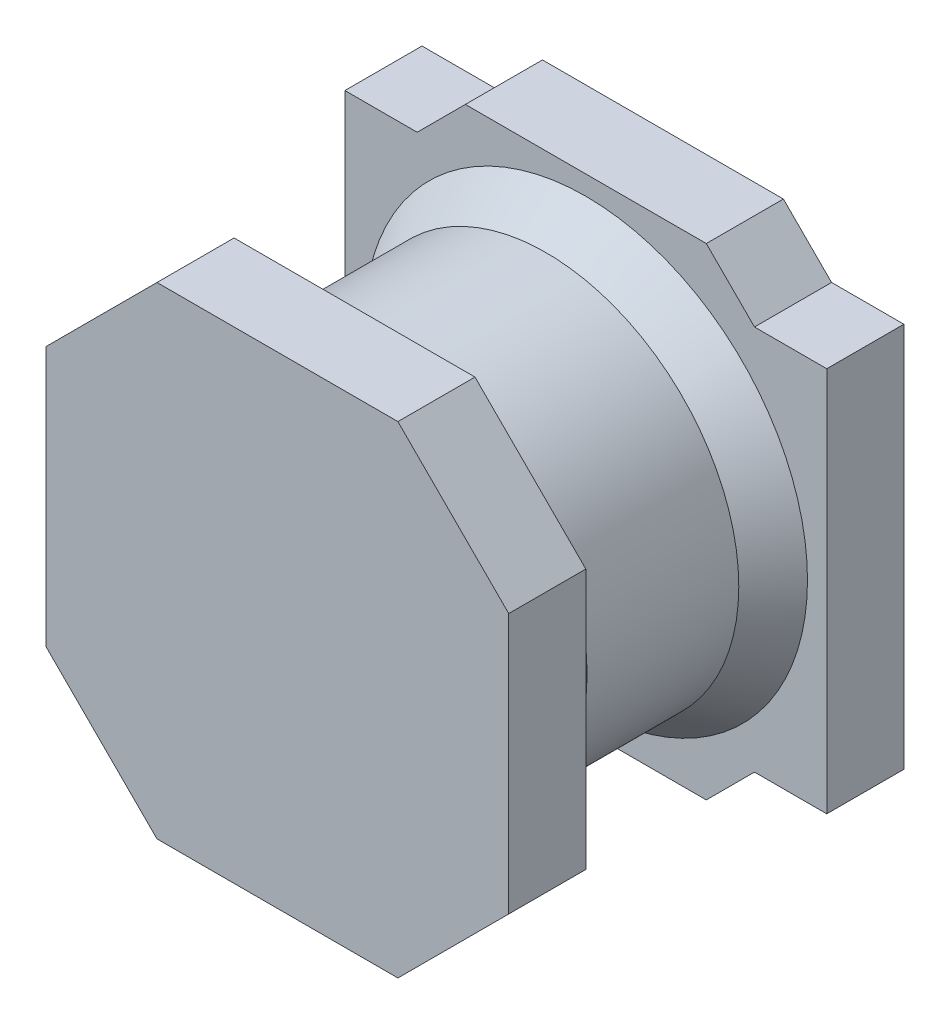
ISO-10303-21;
HEADER;
FILE_DESCRIPTION(('STEP AP214'),'2;1');
FILE_NAME('part.step','',(''),(''),'','','');
FILE_SCHEMA(('AUTOMOTIVE_DESIGN { 1 0 10303 214 1 1 1 1 }'));
ENDSEC;
DATA;
#1=APPLICATION_CONTEXT('core data for automotive mechanical design processes');
#2=APPLICATION_PROTOCOL_DEFINITION('international standard','automotive_design',2000,#1);
#3=PRODUCT_CONTEXT('',#1,'mechanical');
#4=PRODUCT('Part','Part','',(#3));
#5=PRODUCT_RELATED_PRODUCT_CATEGORY('part','',(#4));
#6=PRODUCT_DEFINITION_FORMATION('','',#4);
#7=PRODUCT_DEFINITION_CONTEXT('part definition',#1,'design');
#8=PRODUCT_DEFINITION('design','',#6,#7);
#9=PRODUCT_DEFINITION_SHAPE('','',#8);
#10=(LENGTH_UNIT() NAMED_UNIT(*) SI_UNIT(.MILLI.,.METRE.));
#11=(NAMED_UNIT(*) PLANE_ANGLE_UNIT() SI_UNIT($,.RADIAN.));
#12=(NAMED_UNIT(*) SI_UNIT($,.STERADIAN.) SOLID_ANGLE_UNIT());
#13=UNCERTAINTY_MEASURE_WITH_UNIT(LENGTH_MEASURE(1.E-05),#10,'distance_accuracy_value','');
#14=(GEOMETRIC_REPRESENTATION_CONTEXT(3) GLOBAL_UNCERTAINTY_ASSIGNED_CONTEXT((#13)) GLOBAL_UNIT_ASSIGNED_CONTEXT((#10,
#11,#12)) REPRESENTATION_CONTEXT('',''));
#15=CARTESIAN_POINT('',(0.,0.,0.));
#16=DIRECTION('',(0.,0.,1.));
#17=DIRECTION('',(1.,0.,0.));
#18=AXIS2_PLACEMENT_3D('',#15,#16,#17);
#19=CARTESIAN_POINT('',(-1.25,2.5,0.8));
#20=DIRECTION('',(0.707106781186548,-0.707106781186547,0.));
#21=DIRECTION('',(0.707106781186547,0.707106781186548,0.));
#22=AXIS2_PLACEMENT_3D('',#19,#20,#21);
#23=PLANE('',#22);
#24=DIRECTION('',(-0.707106781186547,-0.707106781186548,0.));
#25=VECTOR('',#24,1.);
#26=CARTESIAN_POINT('',(-1.25,2.5,0.));
#27=LINE('',#26,#25);
#28=CARTESIAN_POINT('',(-1.25,2.5,0.));
#29=VERTEX_POINT('',#28);
#30=CARTESIAN_POINT('',(-1.75,2.,0.));
#31=VERTEX_POINT('',#30);
#32=EDGE_CURVE('E168',#29,#31,#27,.T.);
#33=ORIENTED_EDGE('',*,*,#32,.T.);
#34=DIRECTION('',(0.,0.,-1.));
#35=VECTOR('',#34,1.);
#36=CARTESIAN_POINT('',(-1.75,2.,0.8));
#37=LINE('',#36,#35);
#38=CARTESIAN_POINT('',(-1.75,2.,0.8));
#39=VERTEX_POINT('',#38);
#40=EDGE_CURVE('E11',#39,#31,#37,.T.);
#41=ORIENTED_EDGE('',*,*,#40,.F.);
#42=DIRECTION('',(-0.707106781186547,-0.707106781186548,0.));
#43=VECTOR('',#42,1.);
#44=CARTESIAN_POINT('',(-1.25,2.5,0.8));
#45=LINE('',#44,#43);
#46=CARTESIAN_POINT('',(-1.25,2.5,0.8));
#47=VERTEX_POINT('',#46);
#48=EDGE_CURVE('E202',#47,#39,#45,.T.);
#49=ORIENTED_EDGE('',*,*,#48,.F.);
#50=DIRECTION('',(0.,0.,-1.));
#51=VECTOR('',#50,1.);
#52=CARTESIAN_POINT('',(-1.25,2.5,0.8));
#53=LINE('',#52,#51);
#54=EDGE_CURVE('E164',#47,#29,#53,.T.);
#55=ORIENTED_EDGE('',*,*,#54,.T.);
#56=EDGE_LOOP('',(#33,#41,#49,#55));
#57=FACE_BOUND('',#56,.T.);
#58=ADVANCED_FACE('F37',(#57),#23,.F.);
#59=CARTESIAN_POINT('',(-1.75,2.,0.8));
#60=DIRECTION('',(0.,-1.,0.));
#61=DIRECTION('',(1.,0.,0.));
#62=AXIS2_PLACEMENT_3D('',#59,#60,#61);
#63=PLANE('',#62);
#64=DIRECTION('',(-1.,0.,0.));
#65=VECTOR('',#64,1.);
#66=CARTESIAN_POINT('',(-1.75,2.,0.));
#67=LINE('',#66,#65);
#68=CARTESIAN_POINT('',(-2.5,2.,0.));
#69=VERTEX_POINT('',#68);
#70=EDGE_CURVE('E172',#31,#69,#67,.T.);
#71=ORIENTED_EDGE('',*,*,#70,.T.);
#72=DIRECTION('',(0.,0.,-1.));
#73=VECTOR('',#72,1.);
#74=CARTESIAN_POINT('',(-2.5,2.,0.8));
#75=LINE('',#74,#73);
#76=CARTESIAN_POINT('',(-2.5,2.,0.8));
#77=VERTEX_POINT('',#76);
#78=EDGE_CURVE('E46',#77,#69,#75,.T.);
#79=ORIENTED_EDGE('',*,*,#78,.F.);
#80=DIRECTION('',(-1.,0.,0.));
#81=VECTOR('',#80,1.);
#82=CARTESIAN_POINT('',(-1.75,2.,0.8));
#83=LINE('',#82,#81);
#84=EDGE_CURVE('E110',#39,#77,#83,.T.);
#85=ORIENTED_EDGE('',*,*,#84,.F.);
#86=ORIENTED_EDGE('',*,*,#40,.T.);
#87=EDGE_LOOP('',(#71,#79,#85,#86));
#88=FACE_BOUND('',#87,.T.);
#89=ADVANCED_FACE('F389',(#88),#63,.F.);
#90=CARTESIAN_POINT('',(-2.5,2.,0.8));
#91=DIRECTION('',(1.,0.,0.));
#92=DIRECTION('',(0.,0.,-1.));
#93=AXIS2_PLACEMENT_3D('',#90,#91,#92);
#94=PLANE('',#93);
#95=DIRECTION('',(0.,-1.,0.));
#96=VECTOR('',#95,1.);
#97=CARTESIAN_POINT('',(-2.5,2.,0.));
#98=LINE('',#97,#96);
#99=CARTESIAN_POINT('',(-2.5,-2.,0.));
#100=VERTEX_POINT('',#99);
#101=EDGE_CURVE('E176',#69,#100,#98,.T.);
#102=ORIENTED_EDGE('',*,*,#101,.T.);
#103=DIRECTION('',(0.,0.,-1.));
#104=VECTOR('',#103,1.);
#105=CARTESIAN_POINT('',(-2.5,-2.,0.8));
#106=LINE('',#105,#104);
#107=CARTESIAN_POINT('',(-2.5,-2.,0.8));
#108=VERTEX_POINT('',#107);
#109=EDGE_CURVE('E229',#108,#100,#106,.T.);
#110=ORIENTED_EDGE('',*,*,#109,.F.);
#111=DIRECTION('',(0.,-1.,0.));
#112=VECTOR('',#111,1.);
#113=CARTESIAN_POINT('',(-2.5,2.,0.8));
#114=LINE('',#113,#112);
#115=EDGE_CURVE('E240',#77,#108,#114,.T.);
#116=ORIENTED_EDGE('',*,*,#115,.F.);
#117=ORIENTED_EDGE('',*,*,#78,.T.);
#118=EDGE_LOOP('',(#102,#110,#116,#117));
#119=FACE_BOUND('',#118,.T.);
#120=ADVANCED_FACE('F238',(#119),#94,.F.);
#121=CARTESIAN_POINT('',(-1.75,-2.,0.8));
#122=DIRECTION('',(0.,1.,0.));
#123=DIRECTION('',(-1.,0.,0.));
#124=AXIS2_PLACEMENT_3D('',#121,#122,#123);
#125=PLANE('',#124);
#126=DIRECTION('',(1.,0.,0.));
#127=VECTOR('',#126,1.);
#128=CARTESIAN_POINT('',(-1.75,-2.,0.));
#129=LINE('',#128,#127);
#130=CARTESIAN_POINT('',(-1.75,-2.,0.));
#131=VERTEX_POINT('',#130);
#132=EDGE_CURVE('E179',#100,#131,#129,.T.);
#133=ORIENTED_EDGE('',*,*,#132,.T.);
#134=DIRECTION('',(0.,0.,-1.));
#135=VECTOR('',#134,1.);
#136=CARTESIAN_POINT('',(-1.75,-2.,0.8));
#137=LINE('',#136,#135);
#138=CARTESIAN_POINT('',(-1.75,-2.,0.8));
#139=VERTEX_POINT('',#138);
#140=EDGE_CURVE('E225',#139,#131,#137,.T.);
#141=ORIENTED_EDGE('',*,*,#140,.F.);
#142=DIRECTION('',(1.,0.,0.));
#143=VECTOR('',#142,1.);
#144=CARTESIAN_POINT('',(-1.75,-2.,0.8));
#145=LINE('',#144,#143);
#146=EDGE_CURVE('E259',#108,#139,#145,.T.);
#147=ORIENTED_EDGE('',*,*,#146,.F.);
#148=ORIENTED_EDGE('',*,*,#109,.T.);
#149=EDGE_LOOP('',(#133,#141,#147,#148));
#150=FACE_BOUND('',#149,.T.);
#151=ADVANCED_FACE('F249',(#150),#125,.F.);
#152=CARTESIAN_POINT('',(-1.25,-2.5,0.8));
#153=DIRECTION('',(0.707106781186549,0.707106781186546,0.));
#154=DIRECTION('',(-0.707106781186546,0.707106781186549,0.));
#155=AXIS2_PLACEMENT_3D('',#152,#153,#154);
#156=PLANE('',#155);
#157=DIRECTION('',(0.707106781186546,-0.707106781186549,0.));
#158=VECTOR('',#157,1.);
#159=CARTESIAN_POINT('',(-1.25,-2.5,0.));
#160=LINE('',#159,#158);
#161=CARTESIAN_POINT('',(-1.25,-2.5,0.));
#162=VERTEX_POINT('',#161);
#163=EDGE_CURVE('E182',#131,#162,#160,.T.);
#164=ORIENTED_EDGE('',*,*,#163,.T.);
#165=DIRECTION('',(0.,0.,-1.));
#166=VECTOR('',#165,1.);
#167=CARTESIAN_POINT('',(-1.25,-2.5,0.8));
#168=LINE('',#167,#166);
#169=CARTESIAN_POINT('',(-1.25,-2.5,0.8));
#170=VERTEX_POINT('',#169);
#171=EDGE_CURVE('E221',#170,#162,#168,.T.);
#172=ORIENTED_EDGE('',*,*,#171,.F.);
#173=DIRECTION('',(0.707106781186546,-0.707106781186549,0.));
#174=VECTOR('',#173,1.);
#175=CARTESIAN_POINT('',(-1.25,-2.5,0.8));
#176=LINE('',#175,#174);
#177=EDGE_CURVE('E255',#139,#170,#176,.T.);
#178=ORIENTED_EDGE('',*,*,#177,.F.);
#179=ORIENTED_EDGE('',*,*,#140,.T.);
#180=EDGE_LOOP('',(#164,#172,#178,#179));
#181=FACE_BOUND('',#180,.T.);
#182=ADVANCED_FACE('F253',(#181),#156,.F.);
#183=CARTESIAN_POINT('',(-1.25,-2.5,0.8));
#184=DIRECTION('',(0.,1.,0.));
#185=DIRECTION('',(0.,0.,1.));
#186=AXIS2_PLACEMENT_3D('',#183,#184,#185);
#187=PLANE('',#186);
#188=DIRECTION('',(1.,0.,0.));
#189=VECTOR('',#188,1.);
#190=CARTESIAN_POINT('',(-1.25,-2.5,0.));
#191=LINE('',#190,#189);
#192=CARTESIAN_POINT('',(1.25,-2.5,0.));
#193=VERTEX_POINT('',#192);
#194=EDGE_CURVE('E185',#162,#193,#191,.T.);
#195=ORIENTED_EDGE('',*,*,#194,.T.);
#196=DIRECTION('',(0.,0.,-1.));
#197=VECTOR('',#196,1.);
#198=CARTESIAN_POINT('',(1.25,-2.5,0.8));
#199=LINE('',#198,#197);
#200=CARTESIAN_POINT('',(1.25,-2.5,0.8));
#201=VERTEX_POINT('',#200);
#202=EDGE_CURVE('E217',#201,#193,#199,.T.);
#203=ORIENTED_EDGE('',*,*,#202,.F.);
#204=DIRECTION('',(1.,0.,0.));
#205=VECTOR('',#204,1.);
#206=CARTESIAN_POINT('',(-1.25,-2.5,0.8));
#207=LINE('',#206,#205);
#208=EDGE_CURVE('E258',#170,#201,#207,.T.);
#209=ORIENTED_EDGE('',*,*,#208,.F.);
#210=ORIENTED_EDGE('',*,*,#171,.T.);
#211=EDGE_LOOP('',(#195,#203,#209,#210));
#212=FACE_BOUND('',#211,.T.);
#213=ADVANCED_FACE('F401',(#212),#187,.F.);
#214=CARTESIAN_POINT('',(1.25,-2.5,0.8));
#215=DIRECTION('',(-0.707106781186549,0.707106781186546,0.));
#216=DIRECTION('',(-0.707106781186546,-0.707106781186549,0.));
#217=AXIS2_PLACEMENT_3D('',#214,#215,#216);
#218=PLANE('',#217);
#219=DIRECTION('',(0.707106781186546,0.707106781186549,0.));
#220=VECTOR('',#219,1.);
#221=CARTESIAN_POINT('',(1.25,-2.5,0.));
#222=LINE('',#221,#220);
#223=CARTESIAN_POINT('',(1.75,-2.,0.));
#224=VERTEX_POINT('',#223);
#225=EDGE_CURVE('E188',#193,#224,#222,.T.);
#226=ORIENTED_EDGE('',*,*,#225,.T.);
#227=DIRECTION('',(0.,0.,-1.));
#228=VECTOR('',#227,1.);
#229=CARTESIAN_POINT('',(1.75,-2.,0.8));
#230=LINE('',#229,#228);
#231=CARTESIAN_POINT('',(1.75,-2.,0.8));
#232=VERTEX_POINT('',#231);
#233=EDGE_CURVE('E213',#232,#224,#230,.T.);
#234=ORIENTED_EDGE('',*,*,#233,.F.);
#235=DIRECTION('',(0.707106781186546,0.707106781186549,0.));
#236=VECTOR('',#235,1.);
#237=CARTESIAN_POINT('',(1.25,-2.5,0.8));
#238=LINE('',#237,#236);
#239=EDGE_CURVE('E263',#201,#232,#238,.T.);
#240=ORIENTED_EDGE('',*,*,#239,.F.);
#241=ORIENTED_EDGE('',*,*,#202,.T.);
#242=EDGE_LOOP('',(#226,#234,#240,#241));
#243=FACE_BOUND('',#242,.T.);
#244=ADVANCED_FACE('F404',(#243),#218,.F.);
#245=CARTESIAN_POINT('',(1.75,-2.,0.8));
#246=DIRECTION('',(0.,1.,0.));
#247=DIRECTION('',(-1.,0.,0.));
#248=AXIS2_PLACEMENT_3D('',#245,#246,#247);
#249=PLANE('',#248);
#250=DIRECTION('',(1.,0.,0.));
#251=VECTOR('',#250,1.);
#252=CARTESIAN_POINT('',(1.75,-2.,0.));
#253=LINE('',#252,#251);
#254=CARTESIAN_POINT('',(2.5,-2.,0.));
#255=VERTEX_POINT('',#254);
#256=EDGE_CURVE('E190',#224,#255,#253,.T.);
#257=ORIENTED_EDGE('',*,*,#256,.T.);
#258=DIRECTION('',(0.,0.,-1.));
#259=VECTOR('',#258,1.);
#260=CARTESIAN_POINT('',(2.5,-2.,0.8));
#261=LINE('',#260,#259);
#262=CARTESIAN_POINT('',(2.5,-2.,0.8));
#263=VERTEX_POINT('',#262);
#264=EDGE_CURVE('E209',#263,#255,#261,.T.);
#265=ORIENTED_EDGE('',*,*,#264,.F.);
#266=DIRECTION('',(1.,0.,0.));
#267=VECTOR('',#266,1.);
#268=CARTESIAN_POINT('',(1.75,-2.,0.8));
#269=LINE('',#268,#267);
#270=EDGE_CURVE('E271',#232,#263,#269,.T.);
#271=ORIENTED_EDGE('',*,*,#270,.F.);
#272=ORIENTED_EDGE('',*,*,#233,.T.);
#273=EDGE_LOOP('',(#257,#265,#271,#272));
#274=FACE_BOUND('',#273,.T.);
#275=ADVANCED_FACE('F408',(#274),#249,.F.);
#276=CARTESIAN_POINT('',(2.5,2.,0.8));
#277=DIRECTION('',(-1.,0.,0.));
#278=DIRECTION('',(0.,0.,1.));
#279=AXIS2_PLACEMENT_3D('',#276,#277,#278);
#280=PLANE('',#279);
#281=DIRECTION('',(0.,1.,0.));
#282=VECTOR('',#281,1.);
#283=CARTESIAN_POINT('',(2.5,2.,0.));
#284=LINE('',#283,#282);
#285=CARTESIAN_POINT('',(2.5,2.,0.));
#286=VERTEX_POINT('',#285);
#287=EDGE_CURVE('E193',#255,#286,#284,.T.);
#288=ORIENTED_EDGE('',*,*,#287,.T.);
#289=DIRECTION('',(0.,0.,-1.));
#290=VECTOR('',#289,1.);
#291=CARTESIAN_POINT('',(2.5,2.,0.8));
#292=LINE('',#291,#290);
#293=CARTESIAN_POINT('',(2.5,2.,0.8));
#294=VERTEX_POINT('',#293);
#295=EDGE_CURVE('E155',#294,#286,#292,.T.);
#296=ORIENTED_EDGE('',*,*,#295,.F.);
#297=DIRECTION('',(0.,1.,0.));
#298=VECTOR('',#297,1.);
#299=CARTESIAN_POINT('',(2.5,2.,0.8));
#300=LINE('',#299,#298);
#301=EDGE_CURVE('E144',#263,#294,#300,.T.);
#302=ORIENTED_EDGE('',*,*,#301,.F.);
#303=ORIENTED_EDGE('',*,*,#264,.T.);
#304=EDGE_LOOP('',(#288,#296,#302,#303));
#305=FACE_BOUND('',#304,.T.);
#306=ADVANCED_FACE('F412',(#305),#280,.F.);
#307=CARTESIAN_POINT('',(1.75,2.,0.8));
#308=DIRECTION('',(0.,-1.,0.));
#309=DIRECTION('',(1.,0.,0.));
#310=AXIS2_PLACEMENT_3D('',#307,#308,#309);
#311=PLANE('',#310);
#312=DIRECTION('',(-1.,0.,0.));
#313=VECTOR('',#312,1.);
#314=CARTESIAN_POINT('',(1.75,2.,0.));
#315=LINE('',#314,#313);
#316=CARTESIAN_POINT('',(1.75,2.,0.));
#317=VERTEX_POINT('',#316);
#318=EDGE_CURVE('E153',#286,#317,#315,.T.);
#319=ORIENTED_EDGE('',*,*,#318,.T.);
#320=DIRECTION('',(0.,0.,-1.));
#321=VECTOR('',#320,1.);
#322=CARTESIAN_POINT('',(1.75,2.,0.8));
#323=LINE('',#322,#321);
#324=CARTESIAN_POINT('',(1.75,2.,0.8));
#325=VERTEX_POINT('',#324);
#326=EDGE_CURVE('E150',#325,#317,#323,.T.);
#327=ORIENTED_EDGE('',*,*,#326,.F.);
#328=DIRECTION('',(-1.,0.,0.));
#329=VECTOR('',#328,1.);
#330=CARTESIAN_POINT('',(1.75,2.,0.8));
#331=LINE('',#330,#329);
#332=EDGE_CURVE('E138',#294,#325,#331,.T.);
#333=ORIENTED_EDGE('',*,*,#332,.F.);
#334=ORIENTED_EDGE('',*,*,#295,.T.);
#335=EDGE_LOOP('',(#319,#327,#333,#334));
#336=FACE_BOUND('',#335,.T.);
#337=ADVANCED_FACE('F151',(#336),#311,.F.);
#338=CARTESIAN_POINT('',(1.25,2.5,0.8));
#339=DIRECTION('',(-0.707106781186548,-0.707106781186547,0.));
#340=DIRECTION('',(0.707106781186547,-0.707106781186548,0.));
#341=AXIS2_PLACEMENT_3D('',#338,#339,#340);
#342=PLANE('',#341);
#343=DIRECTION('',(-0.707106781186547,0.707106781186548,0.));
#344=VECTOR('',#343,1.);
#345=CARTESIAN_POINT('',(1.25,2.5,0.));
#346=LINE('',#345,#344);
#347=CARTESIAN_POINT('',(1.25,2.5,0.));
#348=VERTEX_POINT('',#347);
#349=EDGE_CURVE('E96',#317,#348,#346,.T.);
#350=ORIENTED_EDGE('',*,*,#349,.T.);
#351=DIRECTION('',(0.,0.,-1.));
#352=VECTOR('',#351,1.);
#353=CARTESIAN_POINT('',(1.25,2.5,0.8));
#354=LINE('',#353,#352);
#355=CARTESIAN_POINT('',(1.25,2.5,0.8));
#356=VERTEX_POINT('',#355);
#357=EDGE_CURVE('E156',#356,#348,#354,.T.);
#358=ORIENTED_EDGE('',*,*,#357,.F.);
#359=DIRECTION('',(-0.707106781186547,0.707106781186548,0.));
#360=VECTOR('',#359,1.);
#361=CARTESIAN_POINT('',(1.25,2.5,0.8));
#362=LINE('',#361,#360);
#363=EDGE_CURVE('E142',#325,#356,#362,.T.);
#364=ORIENTED_EDGE('',*,*,#363,.F.);
#365=ORIENTED_EDGE('',*,*,#326,.T.);
#366=EDGE_LOOP('',(#350,#358,#364,#365));
#367=FACE_BOUND('',#366,.T.);
#368=ADVANCED_FACE('F158',(#367),#342,.F.);
#369=CARTESIAN_POINT('',(-1.25,2.5,0.8));
#370=DIRECTION('',(0.,-1.,0.));
#371=DIRECTION('',(0.,0.,-1.));
#372=AXIS2_PLACEMENT_3D('',#369,#370,#371);
#373=PLANE('',#372);
#374=DIRECTION('',(-1.,0.,0.));
#375=VECTOR('',#374,1.);
#376=CARTESIAN_POINT('',(-1.25,2.5,0.));
#377=LINE('',#376,#375);
#378=EDGE_CURVE('E102',#348,#29,#377,.T.);
#379=ORIENTED_EDGE('',*,*,#378,.T.);
#380=ORIENTED_EDGE('',*,*,#54,.F.);
#381=DIRECTION('',(-1.,0.,0.));
#382=VECTOR('',#381,1.);
#383=CARTESIAN_POINT('',(-1.25,2.5,0.8));
#384=LINE('',#383,#382);
#385=EDGE_CURVE('E54',#356,#47,#384,.T.);
#386=ORIENTED_EDGE('',*,*,#385,.F.);
#387=ORIENTED_EDGE('',*,*,#357,.T.);
#388=EDGE_LOOP('',(#379,#380,#386,#387));
#389=FACE_BOUND('',#388,.T.);
#390=ADVANCED_FACE('F421',(#389),#373,.F.);
#391=CARTESIAN_POINT('',(0.,0.,0.8));
#392=DIRECTION('',(0.,0.,-1.));
#393=DIRECTION('',(-1.,0.,0.));
#394=AXIS2_PLACEMENT_3D('',#391,#392,#393);
#395=PLANE('',#394);
#396=CARTESIAN_POINT('',(0.,0.,0.8));
#397=DIRECTION('',(0.,0.,-1.));
#398=DIRECTION('',(-1.,0.,0.));
#399=AXIS2_PLACEMENT_3D('',#396,#397,#398);
#400=CIRCLE('',#399,2.3);
#401=CARTESIAN_POINT('',(-2.3,0.,0.8));
#402=VERTEX_POINT('',#401);
#403=EDGE_CURVE('E173',#402,#402,#400,.T.);
#404=ORIENTED_EDGE('',*,*,#403,.T.);
#405=EDGE_LOOP('',(#404));
#406=FACE_BOUND('',#405,.T.);
#407=ORIENTED_EDGE('',*,*,#48,.T.);
#408=ORIENTED_EDGE('',*,*,#84,.T.);
#409=ORIENTED_EDGE('',*,*,#115,.T.);
#410=ORIENTED_EDGE('',*,*,#146,.T.);
#411=ORIENTED_EDGE('',*,*,#177,.T.);
#412=ORIENTED_EDGE('',*,*,#208,.T.);
#413=ORIENTED_EDGE('',*,*,#239,.T.);
#414=ORIENTED_EDGE('',*,*,#270,.T.);
#415=ORIENTED_EDGE('',*,*,#301,.T.);
#416=ORIENTED_EDGE('',*,*,#332,.T.);
#417=ORIENTED_EDGE('',*,*,#363,.T.);
#418=ORIENTED_EDGE('',*,*,#385,.T.);
#419=EDGE_LOOP('',(#407,#408,#409,#410,#411,#412,#413,#414,#415,#416,#417,#418));
#420=FACE_BOUND('',#419,.T.);
#421=ADVANCED_FACE('F140',(#406,#420),#395,.F.);
#422=CARTESIAN_POINT('',(0.,0.,0.));
#423=DIRECTION('',(0.,0.,-1.));
#424=DIRECTION('',(-1.,0.,0.));
#425=AXIS2_PLACEMENT_3D('',#422,#423,#424);
#426=PLANE('',#425);
#427=ORIENTED_EDGE('',*,*,#32,.F.);
#428=ORIENTED_EDGE('',*,*,#378,.F.);
#429=ORIENTED_EDGE('',*,*,#349,.F.);
#430=ORIENTED_EDGE('',*,*,#318,.F.);
#431=ORIENTED_EDGE('',*,*,#287,.F.);
#432=ORIENTED_EDGE('',*,*,#256,.F.);
#433=ORIENTED_EDGE('',*,*,#225,.F.);
#434=ORIENTED_EDGE('',*,*,#194,.F.);
#435=ORIENTED_EDGE('',*,*,#163,.F.);
#436=ORIENTED_EDGE('',*,*,#132,.F.);
#437=ORIENTED_EDGE('',*,*,#101,.F.);
#438=ORIENTED_EDGE('',*,*,#70,.F.);
#439=EDGE_LOOP('',(#427,#428,#429,#430,#431,#432,#433,#434,#435,#436,#437,#438));
#440=FACE_BOUND('',#439,.T.);
#441=ADVANCED_FACE('F244',(#440),#426,.T.);
#442=CARTESIAN_POINT('',(0.,0.,1.21291457614135));
#443=DIRECTION('',(0.,0.,-1.));
#444=DIRECTION('',(-1.,0.,0.));
#445=AXIS2_PLACEMENT_3D('',#442,#443,#444);
#446=CONICAL_SURFACE('',#445,2.,0.628318530717965);
#447=ORIENTED_EDGE('',*,*,#403,.F.);
#448=EDGE_LOOP('',(#447));
#449=FACE_BOUND('',#448,.T.);
#450=CARTESIAN_POINT('',(0.,0.,1.21291457614135));
#451=DIRECTION('',(0.,0.,-1.));
#452=DIRECTION('',(-1.,0.,0.));
#453=AXIS2_PLACEMENT_3D('',#450,#451,#452);
#454=CIRCLE('',#453,2.);
#455=CARTESIAN_POINT('',(-2.,0.,1.21291457614135));
#456=VERTEX_POINT('',#455);
#457=EDGE_CURVE('E281',#456,#456,#454,.T.);
#458=ORIENTED_EDGE('',*,*,#457,.T.);
#459=EDGE_LOOP('',(#458));
#460=FACE_BOUND('',#459,.T.);
#461=ADVANCED_FACE('F426',(#449,#460),#446,.T.);
#462=CARTESIAN_POINT('',(0.,0.,0.8));
#463=DIRECTION('',(0.,0.,-1.));
#464=DIRECTION('',(-1.,0.,0.));
#465=AXIS2_PLACEMENT_3D('',#462,#463,#464);
#466=CYLINDRICAL_SURFACE('',#465,2.);
#467=ORIENTED_EDGE('',*,*,#457,.F.);
#468=EDGE_LOOP('',(#467));
#469=FACE_BOUND('',#468,.T.);
#470=CARTESIAN_POINT('',(0.,0.,2.78708542385865));
#471=DIRECTION('',(0.,0.,-1.));
#472=DIRECTION('',(-1.,0.,0.));
#473=AXIS2_PLACEMENT_3D('',#470,#471,#472);
#474=CIRCLE('',#473,2.);
#475=CARTESIAN_POINT('',(-2.,0.,2.78708542385865));
#476=VERTEX_POINT('',#475);
#477=EDGE_CURVE('E283',#476,#476,#474,.T.);
#478=ORIENTED_EDGE('',*,*,#477,.T.);
#479=EDGE_LOOP('',(#478));
#480=FACE_BOUND('',#479,.T.);
#481=ADVANCED_FACE('F432',(#469,#480),#466,.T.);
#482=CARTESIAN_POINT('',(0.,0.,3.2));
#483=DIRECTION('',(0.,0.,1.));
#484=DIRECTION('',(1.,0.,0.));
#485=AXIS2_PLACEMENT_3D('',#482,#483,#484);
#486=CONICAL_SURFACE('',#485,2.3,0.628318530717965);
#487=ORIENTED_EDGE('',*,*,#477,.F.);
#488=EDGE_LOOP('',(#487));
#489=FACE_BOUND('',#488,.T.);
#490=CARTESIAN_POINT('',(0.,0.,3.2));
#491=DIRECTION('',(0.,0.,-1.));
#492=DIRECTION('',(-1.,0.,0.));
#493=AXIS2_PLACEMENT_3D('',#490,#491,#492);
#494=CIRCLE('',#493,2.3);
#495=CARTESIAN_POINT('',(-2.3,0.,3.2));
#496=VERTEX_POINT('',#495);
#497=EDGE_CURVE('E372',#496,#496,#494,.T.);
#498=ORIENTED_EDGE('',*,*,#497,.T.);
#499=EDGE_LOOP('',(#498));
#500=FACE_BOUND('',#499,.T.);
#501=ADVANCED_FACE('F436',(#489,#500),#486,.T.);
#502=CARTESIAN_POINT('',(1.25,2.5,4.));
#503=DIRECTION('',(-0.707106781186548,-0.707106781186547,0.));
#504=DIRECTION('',(0.707106781186547,-0.707106781186548,0.));
#505=AXIS2_PLACEMENT_3D('',#502,#503,#504);
#506=PLANE('',#505);
#507=DIRECTION('',(-0.707106781186547,0.707106781186548,0.));
#508=VECTOR('',#507,1.);
#509=CARTESIAN_POINT('',(1.25,2.5,3.2));
#510=LINE('',#509,#508);
#511=CARTESIAN_POINT('',(2.4,1.35,3.2));
#512=VERTEX_POINT('',#511);
#513=CARTESIAN_POINT('',(1.25,2.5,3.2));
#514=VERTEX_POINT('',#513);
#515=EDGE_CURVE('E315',#512,#514,#510,.T.);
#516=ORIENTED_EDGE('',*,*,#515,.T.);
#517=DIRECTION('',(0.,0.,-1.));
#518=VECTOR('',#517,1.);
#519=CARTESIAN_POINT('',(1.25,2.5,4.));
#520=LINE('',#519,#518);
#521=CARTESIAN_POINT('',(1.25,2.5,4.));
#522=VERTEX_POINT('',#521);
#523=EDGE_CURVE('E368',#522,#514,#520,.T.);
#524=ORIENTED_EDGE('',*,*,#523,.F.);
#525=DIRECTION('',(-0.707106781186547,0.707106781186548,0.));
#526=VECTOR('',#525,1.);
#527=CARTESIAN_POINT('',(1.25,2.5,4.));
#528=LINE('',#527,#526);
#529=CARTESIAN_POINT('',(2.4,1.35,4.));
#530=VERTEX_POINT('',#529);
#531=EDGE_CURVE('E340',#530,#522,#528,.T.);
#532=ORIENTED_EDGE('',*,*,#531,.F.);
#533=DIRECTION('',(0.,0.,-1.));
#534=VECTOR('',#533,1.);
#535=CARTESIAN_POINT('',(2.4,1.35,4.));
#536=LINE('',#535,#534);
#537=EDGE_CURVE('E314',#530,#512,#536,.T.);
#538=ORIENTED_EDGE('',*,*,#537,.T.);
#539=EDGE_LOOP('',(#516,#524,#532,#538));
#540=FACE_BOUND('',#539,.T.);
#541=ADVANCED_FACE('F440',(#540),#506,.F.);
#542=CARTESIAN_POINT('',(-1.25,2.5,4.));
#543=DIRECTION('',(0.,-1.,0.));
#544=DIRECTION('',(0.,0.,-1.));
#545=AXIS2_PLACEMENT_3D('',#542,#543,#544);
#546=PLANE('',#545);
#547=DIRECTION('',(-1.,0.,0.));
#548=VECTOR('',#547,1.);
#549=CARTESIAN_POINT('',(-1.25,2.5,3.2));
#550=LINE('',#549,#548);
#551=CARTESIAN_POINT('',(-1.25,2.5,3.2));
#552=VERTEX_POINT('',#551);
#553=EDGE_CURVE('E319',#514,#552,#550,.T.);
#554=ORIENTED_EDGE('',*,*,#553,.T.);
#555=DIRECTION('',(0.,0.,-1.));
#556=VECTOR('',#555,1.);
#557=CARTESIAN_POINT('',(-1.25,2.5,4.));
#558=LINE('',#557,#556);
#559=CARTESIAN_POINT('',(-1.25,2.5,4.));
#560=VERTEX_POINT('',#559);
#561=EDGE_CURVE('E364',#560,#552,#558,.T.);
#562=ORIENTED_EDGE('',*,*,#561,.F.);
#563=DIRECTION('',(-1.,0.,0.));
#564=VECTOR('',#563,1.);
#565=CARTESIAN_POINT('',(-1.25,2.5,4.));
#566=LINE('',#565,#564);
#567=EDGE_CURVE('E299',#522,#560,#566,.T.);
#568=ORIENTED_EDGE('',*,*,#567,.F.);
#569=ORIENTED_EDGE('',*,*,#523,.T.);
#570=EDGE_LOOP('',(#554,#562,#568,#569));
#571=FACE_BOUND('',#570,.T.);
#572=ADVANCED_FACE('F444',(#571),#546,.F.);
#573=CARTESIAN_POINT('',(-1.25,2.5,4.));
#574=DIRECTION('',(0.707106781186548,-0.707106781186547,0.));
#575=DIRECTION('',(0.707106781186547,0.707106781186548,0.));
#576=AXIS2_PLACEMENT_3D('',#573,#574,#575);
#577=PLANE('',#576);
#578=DIRECTION('',(-0.707106781186547,-0.707106781186548,0.));
#579=VECTOR('',#578,1.);
#580=CARTESIAN_POINT('',(-1.25,2.5,3.2));
#581=LINE('',#580,#579);
#582=CARTESIAN_POINT('',(-2.4,1.35,3.2));
#583=VERTEX_POINT('',#582);
#584=EDGE_CURVE('E322',#552,#583,#581,.T.);
#585=ORIENTED_EDGE('',*,*,#584,.T.);
#586=DIRECTION('',(0.,0.,-1.));
#587=VECTOR('',#586,1.);
#588=CARTESIAN_POINT('',(-2.4,1.35,4.));
#589=LINE('',#588,#587);
#590=CARTESIAN_POINT('',(-2.4,1.35,4.));
#591=VERTEX_POINT('',#590);
#592=EDGE_CURVE('E360',#591,#583,#589,.T.);
#593=ORIENTED_EDGE('',*,*,#592,.F.);
#594=DIRECTION('',(-0.707106781186547,-0.707106781186548,0.));
#595=VECTOR('',#594,1.);
#596=CARTESIAN_POINT('',(-1.25,2.5,4.));
#597=LINE('',#596,#595);
#598=EDGE_CURVE('E292',#560,#591,#597,.T.);
#599=ORIENTED_EDGE('',*,*,#598,.F.);
#600=ORIENTED_EDGE('',*,*,#561,.T.);
#601=EDGE_LOOP('',(#585,#593,#599,#600));
#602=FACE_BOUND('',#601,.T.);
#603=ADVANCED_FACE('F448',(#602),#577,.F.);
#604=CARTESIAN_POINT('',(-2.4,1.35,4.));
#605=DIRECTION('',(1.,0.,0.));
#606=DIRECTION('',(0.,0.,-1.));
#607=AXIS2_PLACEMENT_3D('',#604,#605,#606);
#608=PLANE('',#607);
#609=DIRECTION('',(0.,-1.,0.));
#610=VECTOR('',#609,1.);
#611=CARTESIAN_POINT('',(-2.4,1.35,3.2));
#612=LINE('',#611,#610);
#613=CARTESIAN_POINT('',(-2.4,-1.35,3.2));
#614=VERTEX_POINT('',#613);
#615=EDGE_CURVE('E326',#583,#614,#612,.T.);
#616=ORIENTED_EDGE('',*,*,#615,.T.);
#617=DIRECTION('',(0.,0.,-1.));
#618=VECTOR('',#617,1.);
#619=CARTESIAN_POINT('',(-2.4,-1.35,4.));
#620=LINE('',#619,#618);
#621=CARTESIAN_POINT('',(-2.4,-1.35,4.));
#622=VERTEX_POINT('',#621);
#623=EDGE_CURVE('E356',#622,#614,#620,.T.);
#624=ORIENTED_EDGE('',*,*,#623,.F.);
#625=DIRECTION('',(0.,-1.,0.));
#626=VECTOR('',#625,1.);
#627=CARTESIAN_POINT('',(-2.4,1.35,4.));
#628=LINE('',#627,#626);
#629=EDGE_CURVE('E289',#591,#622,#628,.T.);
#630=ORIENTED_EDGE('',*,*,#629,.F.);
#631=ORIENTED_EDGE('',*,*,#592,.T.);
#632=EDGE_LOOP('',(#616,#624,#630,#631));
#633=FACE_BOUND('',#632,.T.);
#634=ADVANCED_FACE('F452',(#633),#608,.F.);
#635=CARTESIAN_POINT('',(-1.25,-2.5,4.));
#636=DIRECTION('',(0.707106781186548,0.707106781186547,0.));
#637=DIRECTION('',(-0.707106781186547,0.707106781186548,0.));
#638=AXIS2_PLACEMENT_3D('',#635,#636,#637);
#639=PLANE('',#638);
#640=DIRECTION('',(0.707106781186547,-0.707106781186548,0.));
#641=VECTOR('',#640,1.);
#642=CARTESIAN_POINT('',(-1.25,-2.5,3.2));
#643=LINE('',#642,#641);
#644=CARTESIAN_POINT('',(-1.25,-2.5,3.2));
#645=VERTEX_POINT('',#644);
#646=EDGE_CURVE('E279',#614,#645,#643,.T.);
#647=ORIENTED_EDGE('',*,*,#646,.T.);
#648=DIRECTION('',(0.,0.,-1.));
#649=VECTOR('',#648,1.);
#650=CARTESIAN_POINT('',(-1.25,-2.5,4.));
#651=LINE('',#650,#649);
#652=CARTESIAN_POINT('',(-1.25,-2.5,4.));
#653=VERTEX_POINT('',#652);
#654=EDGE_CURVE('E352',#653,#645,#651,.T.);
#655=ORIENTED_EDGE('',*,*,#654,.F.);
#656=DIRECTION('',(0.707106781186547,-0.707106781186548,0.));
#657=VECTOR('',#656,1.);
#658=CARTESIAN_POINT('',(-1.25,-2.5,4.));
#659=LINE('',#658,#657);
#660=EDGE_CURVE('E286',#622,#653,#659,.T.);
#661=ORIENTED_EDGE('',*,*,#660,.F.);
#662=ORIENTED_EDGE('',*,*,#623,.T.);
#663=EDGE_LOOP('',(#647,#655,#661,#662));
#664=FACE_BOUND('',#663,.T.);
#665=ADVANCED_FACE('F456',(#664),#639,.F.);
#666=CARTESIAN_POINT('',(-1.25,-2.5,4.));
#667=DIRECTION('',(0.,1.,0.));
#668=DIRECTION('',(0.,0.,1.));
#669=AXIS2_PLACEMENT_3D('',#666,#667,#668);
#670=PLANE('',#669);
#671=DIRECTION('',(1.,0.,0.));
#672=VECTOR('',#671,1.);
#673=CARTESIAN_POINT('',(-1.25,-2.5,3.2));
#674=LINE('',#673,#672);
#675=CARTESIAN_POINT('',(1.25,-2.5,3.2));
#676=VERTEX_POINT('',#675);
#677=EDGE_CURVE('E275',#645,#676,#674,.T.);
#678=ORIENTED_EDGE('',*,*,#677,.T.);
#679=DIRECTION('',(0.,0.,-1.));
#680=VECTOR('',#679,1.);
#681=CARTESIAN_POINT('',(1.25,-2.5,4.));
#682=LINE('',#681,#680);
#683=CARTESIAN_POINT('',(1.25,-2.5,4.));
#684=VERTEX_POINT('',#683);
#685=EDGE_CURVE('E348',#684,#676,#682,.T.);
#686=ORIENTED_EDGE('',*,*,#685,.F.);
#687=DIRECTION('',(1.,0.,0.));
#688=VECTOR('',#687,1.);
#689=CARTESIAN_POINT('',(-1.25,-2.5,4.));
#690=LINE('',#689,#688);
#691=EDGE_CURVE('E288',#653,#684,#690,.T.);
#692=ORIENTED_EDGE('',*,*,#691,.F.);
#693=ORIENTED_EDGE('',*,*,#654,.T.);
#694=EDGE_LOOP('',(#678,#686,#692,#693));
#695=FACE_BOUND('',#694,.T.);
#696=ADVANCED_FACE('F460',(#695),#670,.F.);
#697=CARTESIAN_POINT('',(1.25,-2.5,4.));
#698=DIRECTION('',(-0.707106781186548,0.707106781186547,0.));
#699=DIRECTION('',(-0.707106781186547,-0.707106781186548,0.));
#700=AXIS2_PLACEMENT_3D('',#697,#698,#699);
#701=PLANE('',#700);
#702=DIRECTION('',(0.707106781186547,0.707106781186548,0.));
#703=VECTOR('',#702,1.);
#704=CARTESIAN_POINT('',(1.25,-2.5,3.2));
#705=LINE('',#704,#703);
#706=CARTESIAN_POINT('',(2.4,-1.35,3.2));
#707=VERTEX_POINT('',#706);
#708=EDGE_CURVE('E278',#676,#707,#705,.T.);
#709=ORIENTED_EDGE('',*,*,#708,.T.);
#710=DIRECTION('',(0.,0.,-1.));
#711=VECTOR('',#710,1.);
#712=CARTESIAN_POINT('',(2.4,-1.35,4.));
#713=LINE('',#712,#711);
#714=CARTESIAN_POINT('',(2.4,-1.35,4.));
#715=VERTEX_POINT('',#714);
#716=EDGE_CURVE('E344',#715,#707,#713,.T.);
#717=ORIENTED_EDGE('',*,*,#716,.F.);
#718=DIRECTION('',(0.707106781186547,0.707106781186548,0.));
#719=VECTOR('',#718,1.);
#720=CARTESIAN_POINT('',(1.25,-2.5,4.));
#721=LINE('',#720,#719);
#722=EDGE_CURVE('E306',#684,#715,#721,.T.);
#723=ORIENTED_EDGE('',*,*,#722,.F.);
#724=ORIENTED_EDGE('',*,*,#685,.T.);
#725=EDGE_LOOP('',(#709,#717,#723,#724));
#726=FACE_BOUND('',#725,.T.);
#727=ADVANCED_FACE('F464',(#726),#701,.F.);
#728=CARTESIAN_POINT('',(2.4,1.35,4.));
#729=DIRECTION('',(-1.,0.,0.));
#730=DIRECTION('',(0.,0.,1.));
#731=AXIS2_PLACEMENT_3D('',#728,#729,#730);
#732=PLANE('',#731);
#733=DIRECTION('',(0.,1.,0.));
#734=VECTOR('',#733,1.);
#735=CARTESIAN_POINT('',(2.4,1.35,3.2));
#736=LINE('',#735,#734);
#737=EDGE_CURVE('E336',#707,#512,#736,.T.);
#738=ORIENTED_EDGE('',*,*,#737,.T.);
#739=ORIENTED_EDGE('',*,*,#537,.F.);
#740=DIRECTION('',(0.,1.,0.));
#741=VECTOR('',#740,1.);
#742=CARTESIAN_POINT('',(2.4,1.35,4.));
#743=LINE('',#742,#741);
#744=EDGE_CURVE('E310',#715,#530,#743,.T.);
#745=ORIENTED_EDGE('',*,*,#744,.F.);
#746=ORIENTED_EDGE('',*,*,#716,.T.);
#747=EDGE_LOOP('',(#738,#739,#745,#746));
#748=FACE_BOUND('',#747,.T.);
#749=ADVANCED_FACE('F468',(#748),#732,.F.);
#750=CARTESIAN_POINT('',(0.,0.,4.));
#751=DIRECTION('',(0.,0.,1.));
#752=DIRECTION('',(1.,0.,0.));
#753=AXIS2_PLACEMENT_3D('',#750,#751,#752);
#754=PLANE('',#753);
#755=ORIENTED_EDGE('',*,*,#531,.T.);
#756=ORIENTED_EDGE('',*,*,#567,.T.);
#757=ORIENTED_EDGE('',*,*,#598,.T.);
#758=ORIENTED_EDGE('',*,*,#629,.T.);
#759=ORIENTED_EDGE('',*,*,#660,.T.);
#760=ORIENTED_EDGE('',*,*,#691,.T.);
#761=ORIENTED_EDGE('',*,*,#722,.T.);
#762=ORIENTED_EDGE('',*,*,#744,.T.);
#763=EDGE_LOOP('',(#755,#756,#757,#758,#759,#760,#761,#762));
#764=FACE_BOUND('',#763,.T.);
#765=ADVANCED_FACE('F472',(#764),#754,.T.);
#766=CARTESIAN_POINT('',(0.,0.,3.2));
#767=DIRECTION('',(0.,0.,1.));
#768=DIRECTION('',(1.,0.,0.));
#769=AXIS2_PLACEMENT_3D('',#766,#767,#768);
#770=PLANE('',#769);
#771=ORIENTED_EDGE('',*,*,#497,.F.);
#772=EDGE_LOOP('',(#771));
#773=FACE_BOUND('',#772,.T.);
#774=ORIENTED_EDGE('',*,*,#515,.F.);
#775=ORIENTED_EDGE('',*,*,#737,.F.);
#776=ORIENTED_EDGE('',*,*,#708,.F.);
#777=ORIENTED_EDGE('',*,*,#677,.F.);
#778=ORIENTED_EDGE('',*,*,#646,.F.);
#779=ORIENTED_EDGE('',*,*,#615,.F.);
#780=ORIENTED_EDGE('',*,*,#584,.F.);
#781=ORIENTED_EDGE('',*,*,#553,.F.);
#782=EDGE_LOOP('',(#774,#775,#776,#777,#778,#779,#780,#781));
#783=FACE_BOUND('',#782,.T.);
#784=ADVANCED_FACE('F474',(#773,#783),#770,.F.);
#785=CLOSED_SHELL('',(#58,#89,#120,#151,#182,#213,#244,#275,#306,#337,#368,#390,#421,#441,#461,
#481,#501,#541,#572,#603,#634,#665,#696,#727,#749,#765,#784));
#786=MANIFOLD_SOLID_BREP('B2',#785);
#787=ADVANCED_BREP_SHAPE_REPRESENTATION('',(#18,#786),#14);
#788=SHAPE_DEFINITION_REPRESENTATION(#9,#787);
ENDSEC;
END-ISO-10303-21;
